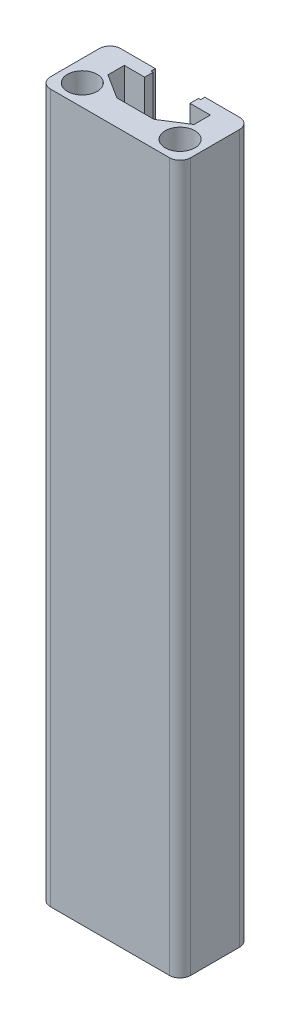
ISO-10303-21;
HEADER;
FILE_DESCRIPTION(('STEP AP214'),'2;1');
FILE_NAME('part.step','',(''),(''),'','','');
FILE_SCHEMA(('AUTOMOTIVE_DESIGN { 1 0 10303 214 1 1 1 1 }'));
ENDSEC;
DATA;
#1=APPLICATION_CONTEXT('core data for automotive mechanical design processes');
#2=APPLICATION_PROTOCOL_DEFINITION('international standard','automotive_design',2000,#1);
#3=PRODUCT_CONTEXT('',#1,'mechanical');
#4=PRODUCT('Part','Part','',(#3));
#5=PRODUCT_RELATED_PRODUCT_CATEGORY('part','',(#4));
#6=PRODUCT_DEFINITION_FORMATION('','',#4);
#7=PRODUCT_DEFINITION_CONTEXT('part definition',#1,'design');
#8=PRODUCT_DEFINITION('design','',#6,#7);
#9=PRODUCT_DEFINITION_SHAPE('','',#8);
#10=(LENGTH_UNIT() NAMED_UNIT(*) SI_UNIT(.MILLI.,.METRE.));
#11=(NAMED_UNIT(*) PLANE_ANGLE_UNIT() SI_UNIT($,.RADIAN.));
#12=(NAMED_UNIT(*) SI_UNIT($,.STERADIAN.) SOLID_ANGLE_UNIT());
#13=UNCERTAINTY_MEASURE_WITH_UNIT(LENGTH_MEASURE(1.E-05),#10,'distance_accuracy_value','');
#14=(GEOMETRIC_REPRESENTATION_CONTEXT(3) GLOBAL_UNCERTAINTY_ASSIGNED_CONTEXT((#13)) GLOBAL_UNIT_ASSIGNED_CONTEXT((#10,
#11,#12)) REPRESENTATION_CONTEXT('',''));
#15=CARTESIAN_POINT('',(0.,0.,0.));
#16=DIRECTION('',(0.,0.,1.));
#17=DIRECTION('',(1.,0.,0.));
#18=AXIS2_PLACEMENT_3D('',#15,#16,#17);
#19=CARTESIAN_POINT('',(8.4,100.,-8.4));
#20=DIRECTION('',(0.,-1.,0.));
#21=DIRECTION('',(0.,0.,-1.));
#22=AXIS2_PLACEMENT_3D('',#19,#20,#21);
#23=PLANE('',#22);
#24=DIRECTION('',(-0.844508578449678,0.,-0.535542025358332));
#25=VECTOR('',#24,1.);
#26=CARTESIAN_POINT('',(-6.07478831126901,100.,-5.79297124600639));
#27=LINE('',#26,#25);
#28=CARTESIAN_POINT('',(-2.61664134641278,100.,-3.6));
#29=VERTEX_POINT('',#28);
#30=CARTESIAN_POINT('',(-6.07478831126901,100.,-5.79297124600639));
#31=VERTEX_POINT('',#30);
#32=EDGE_CURVE('E294',#29,#31,#27,.T.);
#33=ORIENTED_EDGE('',*,*,#32,.T.);
#34=DIRECTION('',(0.,0.,-1.));
#35=VECTOR('',#34,1.);
#36=CARTESIAN_POINT('',(-6.07478831126901,100.,-8.10000000000001));
#37=LINE('',#36,#35);
#38=CARTESIAN_POINT('',(-6.07478831126901,100.,-8.10000000000001));
#39=VERTEX_POINT('',#38);
#40=EDGE_CURVE('E146',#31,#39,#37,.T.);
#41=ORIENTED_EDGE('',*,*,#40,.T.);
#42=DIRECTION('',(1.,0.,0.));
#43=VECTOR('',#42,1.);
#44=CARTESIAN_POINT('',(-3.2,100.,-8.10000000000001));
#45=LINE('',#44,#43);
#46=CARTESIAN_POINT('',(-3.2,100.,-8.10000000000001));
#47=VERTEX_POINT('',#46);
#48=EDGE_CURVE('E371',#39,#47,#45,.T.);
#49=ORIENTED_EDGE('',*,*,#48,.T.);
#50=DIRECTION('',(0.,0.,-1.));
#51=VECTOR('',#50,1.);
#52=CARTESIAN_POINT('',(-3.2,100.,-9.28849840255591));
#53=LINE('',#52,#51);
#54=CARTESIAN_POINT('',(-3.2,100.,-9.28849840255591));
#55=VERTEX_POINT('',#54);
#56=EDGE_CURVE('E391',#47,#55,#53,.T.);
#57=ORIENTED_EDGE('',*,*,#56,.T.);
#58=DIRECTION('',(-1.,0.,0.));
#59=VECTOR('',#58,1.);
#60=CARTESIAN_POINT('',(-3.5,100.,-9.28849840255591));
#61=LINE('',#60,#59);
#62=CARTESIAN_POINT('',(-3.5,100.,-9.28849840255591));
#63=VERTEX_POINT('',#62);
#64=EDGE_CURVE('E387',#55,#63,#61,.T.);
#65=ORIENTED_EDGE('',*,*,#64,.T.);
#66=DIRECTION('',(0.,0.,-1.));
#67=VECTOR('',#66,1.);
#68=CARTESIAN_POINT('',(-3.5,100.,-9.9));
#69=LINE('',#68,#67);
#70=CARTESIAN_POINT('',(-3.5,100.,-9.9));
#71=VERTEX_POINT('',#70);
#72=EDGE_CURVE('E390',#63,#71,#69,.T.);
#73=ORIENTED_EDGE('',*,*,#72,.T.);
#74=DIRECTION('',(-1.,0.,0.));
#75=VECTOR('',#74,1.);
#76=CARTESIAN_POINT('',(-8.39999999999999,100.,-9.9));
#77=LINE('',#76,#75);
#78=CARTESIAN_POINT('',(-8.39999999999999,100.,-9.9));
#79=VERTEX_POINT('',#78);
#80=EDGE_CURVE('E395',#71,#79,#77,.T.);
#81=ORIENTED_EDGE('',*,*,#80,.T.);
#82=CARTESIAN_POINT('',(-8.4,100.,-8.4));
#83=DIRECTION('',(0.,1.,0.));
#84=DIRECTION('',(0.,0.,-1.));
#85=AXIS2_PLACEMENT_3D('',#82,#83,#84);
#86=CIRCLE('',#85,1.5);
#87=CARTESIAN_POINT('',(-9.9,100.,-8.39999999999999));
#88=VERTEX_POINT('',#87);
#89=EDGE_CURVE('E402',#79,#88,#86,.T.);
#90=ORIENTED_EDGE('',*,*,#89,.T.);
#91=DIRECTION('',(0.,0.,1.));
#92=VECTOR('',#91,1.);
#93=CARTESIAN_POINT('',(-9.9,100.,-1.50000000000001));
#94=LINE('',#93,#92);
#95=CARTESIAN_POINT('',(-9.9,100.,-1.50000000000001));
#96=VERTEX_POINT('',#95);
#97=EDGE_CURVE('E405',#88,#96,#94,.T.);
#98=ORIENTED_EDGE('',*,*,#97,.T.);
#99=CARTESIAN_POINT('',(-8.4,100.,-1.5));
#100=DIRECTION('',(0.,1.,0.));
#101=DIRECTION('',(0.,0.,-1.));
#102=AXIS2_PLACEMENT_3D('',#99,#100,#101);
#103=CIRCLE('',#102,1.5);
#104=CARTESIAN_POINT('',(-8.39999999999999,100.,0.));
#105=VERTEX_POINT('',#104);
#106=EDGE_CURVE('E408',#96,#105,#103,.T.);
#107=ORIENTED_EDGE('',*,*,#106,.T.);
#108=DIRECTION('',(1.,0.,0.));
#109=VECTOR('',#108,1.);
#110=CARTESIAN_POINT('',(8.39999999999999,100.,0.));
#111=LINE('',#110,#109);
#112=CARTESIAN_POINT('',(8.39999999999999,100.,0.));
#113=VERTEX_POINT('',#112);
#114=EDGE_CURVE('E411',#105,#113,#111,.T.);
#115=ORIENTED_EDGE('',*,*,#114,.T.);
#116=CARTESIAN_POINT('',(8.4,100.,-1.5));
#117=DIRECTION('',(0.,1.,0.));
#118=DIRECTION('',(0.,0.,-1.));
#119=AXIS2_PLACEMENT_3D('',#116,#117,#118);
#120=CIRCLE('',#119,1.5);
#121=CARTESIAN_POINT('',(9.9,100.,-1.50000000000001));
#122=VERTEX_POINT('',#121);
#123=EDGE_CURVE('E414',#113,#122,#120,.T.);
#124=ORIENTED_EDGE('',*,*,#123,.T.);
#125=DIRECTION('',(0.,0.,-1.));
#126=VECTOR('',#125,1.);
#127=CARTESIAN_POINT('',(9.9,100.,-1.50000000000001));
#128=LINE('',#127,#126);
#129=CARTESIAN_POINT('',(9.9,100.,-8.39999999999999));
#130=VERTEX_POINT('',#129);
#131=EDGE_CURVE('E417',#122,#130,#128,.T.);
#132=ORIENTED_EDGE('',*,*,#131,.T.);
#133=CARTESIAN_POINT('',(8.4,100.,-8.4));
#134=DIRECTION('',(0.,1.,0.));
#135=DIRECTION('',(0.,0.,-1.));
#136=AXIS2_PLACEMENT_3D('',#133,#134,#135);
#137=CIRCLE('',#136,1.5);
#138=CARTESIAN_POINT('',(8.39999999999999,100.,-9.9));
#139=VERTEX_POINT('',#138);
#140=EDGE_CURVE('E420',#130,#139,#137,.T.);
#141=ORIENTED_EDGE('',*,*,#140,.T.);
#142=DIRECTION('',(-1.,0.,0.));
#143=VECTOR('',#142,1.);
#144=CARTESIAN_POINT('',(8.39999999999999,100.,-9.9));
#145=LINE('',#144,#143);
#146=CARTESIAN_POINT('',(3.5,100.,-9.9));
#147=VERTEX_POINT('',#146);
#148=EDGE_CURVE('E423',#139,#147,#145,.T.);
#149=ORIENTED_EDGE('',*,*,#148,.T.);
#150=DIRECTION('',(0.,0.,1.));
#151=VECTOR('',#150,1.);
#152=CARTESIAN_POINT('',(3.5,100.,-9.9));
#153=LINE('',#152,#151);
#154=CARTESIAN_POINT('',(3.5,100.,-9.28849840255591));
#155=VERTEX_POINT('',#154);
#156=EDGE_CURVE('E426',#147,#155,#153,.T.);
#157=ORIENTED_EDGE('',*,*,#156,.T.);
#158=DIRECTION('',(-1.,0.,0.));
#159=VECTOR('',#158,1.);
#160=CARTESIAN_POINT('',(3.5,100.,-9.28849840255591));
#161=LINE('',#160,#159);
#162=CARTESIAN_POINT('',(3.2,100.,-9.28849840255591));
#163=VERTEX_POINT('',#162);
#164=EDGE_CURVE('E429',#155,#163,#161,.T.);
#165=ORIENTED_EDGE('',*,*,#164,.T.);
#166=DIRECTION('',(0.,0.,1.));
#167=VECTOR('',#166,1.);
#168=CARTESIAN_POINT('',(3.2,100.,-9.28849840255591));
#169=LINE('',#168,#167);
#170=CARTESIAN_POINT('',(3.2,100.,-8.10000000000001));
#171=VERTEX_POINT('',#170);
#172=EDGE_CURVE('E432',#163,#171,#169,.T.);
#173=ORIENTED_EDGE('',*,*,#172,.T.);
#174=DIRECTION('',(1.,0.,0.));
#175=VECTOR('',#174,1.);
#176=CARTESIAN_POINT('',(3.2,100.,-8.10000000000001));
#177=LINE('',#176,#175);
#178=CARTESIAN_POINT('',(6.07478831126901,100.,-8.10000000000001));
#179=VERTEX_POINT('',#178);
#180=EDGE_CURVE('E207',#171,#179,#177,.T.);
#181=ORIENTED_EDGE('',*,*,#180,.T.);
#182=DIRECTION('',(0.,0.,1.));
#183=VECTOR('',#182,1.);
#184=CARTESIAN_POINT('',(6.07478831126901,100.,-8.10000000000001));
#185=LINE('',#184,#183);
#186=CARTESIAN_POINT('',(6.07478831126901,100.,-5.79297124600639));
#187=VERTEX_POINT('',#186);
#188=EDGE_CURVE('E201',#179,#187,#185,.T.);
#189=ORIENTED_EDGE('',*,*,#188,.T.);
#190=DIRECTION('',(-0.844508578449678,0.,0.535542025358332));
#191=VECTOR('',#190,1.);
#192=CARTESIAN_POINT('',(6.07478831126901,100.,-5.79297124600639));
#193=LINE('',#192,#191);
#194=CARTESIAN_POINT('',(2.61664134641278,100.,-3.6));
#195=VERTEX_POINT('',#194);
#196=EDGE_CURVE('E205',#187,#195,#193,.T.);
#197=ORIENTED_EDGE('',*,*,#196,.T.);
#198=DIRECTION('',(-1.,0.,0.));
#199=VECTOR('',#198,1.);
#200=CARTESIAN_POINT('',(-2.61664134641278,100.,-3.6));
#201=LINE('',#200,#199);
#202=EDGE_CURVE('E61',#195,#29,#201,.T.);
#203=ORIENTED_EDGE('',*,*,#202,.T.);
#204=EDGE_LOOP('',(#33,#41,#49,#57,#65,#73,#81,#90,#98,#107,#115,#124,#132,#141,#149,#157,#165,
#173,#181,#189,#197,#203));
#205=FACE_BOUND('',#204,.T.);
#206=CARTESIAN_POINT('',(-6.9,100.,-3.));
#207=DIRECTION('',(0.,1.,0.));
#208=DIRECTION('',(0.,0.,1.));
#209=AXIS2_PLACEMENT_3D('',#206,#207,#208);
#210=CIRCLE('',#209,2.1);
#211=CARTESIAN_POINT('',(-6.9,100.,-0.899999999999997));
#212=VERTEX_POINT('',#211);
#213=EDGE_CURVE('E234',#212,#212,#210,.T.);
#214=ORIENTED_EDGE('',*,*,#213,.F.);
#215=EDGE_LOOP('',(#214));
#216=FACE_BOUND('',#215,.T.);
#217=CARTESIAN_POINT('',(6.9,100.,-3.));
#218=DIRECTION('',(0.,1.,0.));
#219=DIRECTION('',(0.,0.,-1.));
#220=AXIS2_PLACEMENT_3D('',#217,#218,#219);
#221=CIRCLE('',#220,2.1);
#222=CARTESIAN_POINT('',(6.9,100.,-5.1));
#223=VERTEX_POINT('',#222);
#224=EDGE_CURVE('E475',#223,#223,#221,.T.);
#225=ORIENTED_EDGE('',*,*,#224,.F.);
#226=EDGE_LOOP('',(#225));
#227=FACE_BOUND('',#226,.T.);
#228=ADVANCED_FACE('F43',(#205,#216,#227),#23,.F.);
#229=CARTESIAN_POINT('',(8.4,0.,-8.4));
#230=DIRECTION('',(0.,-1.,0.));
#231=DIRECTION('',(0.,0.,-1.));
#232=AXIS2_PLACEMENT_3D('',#229,#230,#231);
#233=PLANE('',#232);
#234=CARTESIAN_POINT('',(-6.9,0.,-3.));
#235=DIRECTION('',(0.,1.,0.));
#236=DIRECTION('',(0.,0.,1.));
#237=AXIS2_PLACEMENT_3D('',#234,#235,#236);
#238=CIRCLE('',#237,2.1);
#239=CARTESIAN_POINT('',(-6.9,0.,-0.899999999999997));
#240=VERTEX_POINT('',#239);
#241=EDGE_CURVE('E482',#240,#240,#238,.T.);
#242=ORIENTED_EDGE('',*,*,#241,.T.);
#243=EDGE_LOOP('',(#242));
#244=FACE_BOUND('',#243,.T.);
#245=DIRECTION('',(-0.844508578449678,0.,-0.535542025358332));
#246=VECTOR('',#245,1.);
#247=CARTESIAN_POINT('',(-6.07478831126901,0.,-5.79297124600639));
#248=LINE('',#247,#246);
#249=CARTESIAN_POINT('',(-2.61664134641278,0.,-3.6));
#250=VERTEX_POINT('',#249);
#251=CARTESIAN_POINT('',(-6.07478831126901,0.,-5.79297124600639));
#252=VERTEX_POINT('',#251);
#253=EDGE_CURVE('E229',#250,#252,#248,.T.);
#254=ORIENTED_EDGE('',*,*,#253,.F.);
#255=DIRECTION('',(-1.,0.,0.));
#256=VECTOR('',#255,1.);
#257=CARTESIAN_POINT('',(-2.61664134641278,0.,-3.6));
#258=LINE('',#257,#256);
#259=CARTESIAN_POINT('',(2.61664134641278,0.,-3.6));
#260=VERTEX_POINT('',#259);
#261=EDGE_CURVE('E138',#260,#250,#258,.T.);
#262=ORIENTED_EDGE('',*,*,#261,.F.);
#263=DIRECTION('',(-0.844508578449678,0.,0.535542025358332));
#264=VECTOR('',#263,1.);
#265=CARTESIAN_POINT('',(6.07478831126901,0.,-5.79297124600639));
#266=LINE('',#265,#264);
#267=CARTESIAN_POINT('',(6.07478831126901,0.,-5.79297124600639));
#268=VERTEX_POINT('',#267);
#269=EDGE_CURVE('E132',#268,#260,#266,.T.);
#270=ORIENTED_EDGE('',*,*,#269,.F.);
#271=DIRECTION('',(0.,0.,1.));
#272=VECTOR('',#271,1.);
#273=CARTESIAN_POINT('',(6.07478831126901,0.,-8.10000000000001));
#274=LINE('',#273,#272);
#275=CARTESIAN_POINT('',(6.07478831126901,0.,-8.10000000000001));
#276=VERTEX_POINT('',#275);
#277=EDGE_CURVE('E216',#276,#268,#274,.T.);
#278=ORIENTED_EDGE('',*,*,#277,.F.);
#279=DIRECTION('',(1.,0.,0.));
#280=VECTOR('',#279,1.);
#281=CARTESIAN_POINT('',(3.2,0.,-8.10000000000001));
#282=LINE('',#281,#280);
#283=CARTESIAN_POINT('',(3.2,0.,-8.10000000000001));
#284=VERTEX_POINT('',#283);
#285=EDGE_CURVE('E285',#284,#276,#282,.T.);
#286=ORIENTED_EDGE('',*,*,#285,.F.);
#287=DIRECTION('',(0.,0.,1.));
#288=VECTOR('',#287,1.);
#289=CARTESIAN_POINT('',(3.2,0.,-9.28849840255591));
#290=LINE('',#289,#288);
#291=CARTESIAN_POINT('',(3.2,0.,-9.28849840255591));
#292=VERTEX_POINT('',#291);
#293=EDGE_CURVE('E282',#292,#284,#290,.T.);
#294=ORIENTED_EDGE('',*,*,#293,.F.);
#295=DIRECTION('',(-1.,0.,0.));
#296=VECTOR('',#295,1.);
#297=CARTESIAN_POINT('',(3.5,0.,-9.28849840255591));
#298=LINE('',#297,#296);
#299=CARTESIAN_POINT('',(3.5,0.,-9.28849840255591));
#300=VERTEX_POINT('',#299);
#301=EDGE_CURVE('E279',#300,#292,#298,.T.);
#302=ORIENTED_EDGE('',*,*,#301,.F.);
#303=DIRECTION('',(0.,0.,1.));
#304=VECTOR('',#303,1.);
#305=CARTESIAN_POINT('',(3.5,0.,-9.9));
#306=LINE('',#305,#304);
#307=CARTESIAN_POINT('',(3.5,0.,-9.9));
#308=VERTEX_POINT('',#307);
#309=EDGE_CURVE('E276',#308,#300,#306,.T.);
#310=ORIENTED_EDGE('',*,*,#309,.F.);
#311=DIRECTION('',(-1.,0.,0.));
#312=VECTOR('',#311,1.);
#313=CARTESIAN_POINT('',(8.39999999999999,0.,-9.9));
#314=LINE('',#313,#312);
#315=CARTESIAN_POINT('',(8.39999999999999,0.,-9.9));
#316=VERTEX_POINT('',#315);
#317=EDGE_CURVE('E273',#316,#308,#314,.T.);
#318=ORIENTED_EDGE('',*,*,#317,.F.);
#319=CARTESIAN_POINT('',(8.4,0.,-8.4));
#320=DIRECTION('',(0.,1.,0.));
#321=DIRECTION('',(0.,0.,-1.));
#322=AXIS2_PLACEMENT_3D('',#319,#320,#321);
#323=CIRCLE('',#322,1.5);
#324=CARTESIAN_POINT('',(9.9,0.,-8.39999999999999));
#325=VERTEX_POINT('',#324);
#326=EDGE_CURVE('E270',#325,#316,#323,.T.);
#327=ORIENTED_EDGE('',*,*,#326,.F.);
#328=DIRECTION('',(0.,0.,-1.));
#329=VECTOR('',#328,1.);
#330=CARTESIAN_POINT('',(9.9,0.,-1.50000000000001));
#331=LINE('',#330,#329);
#332=CARTESIAN_POINT('',(9.9,0.,-1.50000000000001));
#333=VERTEX_POINT('',#332);
#334=EDGE_CURVE('E267',#333,#325,#331,.T.);
#335=ORIENTED_EDGE('',*,*,#334,.F.);
#336=CARTESIAN_POINT('',(8.4,0.,-1.5));
#337=DIRECTION('',(0.,1.,0.));
#338=DIRECTION('',(0.,0.,-1.));
#339=AXIS2_PLACEMENT_3D('',#336,#337,#338);
#340=CIRCLE('',#339,1.5);
#341=CARTESIAN_POINT('',(8.39999999999999,0.,0.));
#342=VERTEX_POINT('',#341);
#343=EDGE_CURVE('E264',#342,#333,#340,.T.);
#344=ORIENTED_EDGE('',*,*,#343,.F.);
#345=DIRECTION('',(1.,0.,0.));
#346=VECTOR('',#345,1.);
#347=CARTESIAN_POINT('',(8.39999999999999,0.,0.));
#348=LINE('',#347,#346);
#349=CARTESIAN_POINT('',(-8.39999999999999,0.,0.));
#350=VERTEX_POINT('',#349);
#351=EDGE_CURVE('E261',#350,#342,#348,.T.);
#352=ORIENTED_EDGE('',*,*,#351,.F.);
#353=CARTESIAN_POINT('',(-8.4,0.,-1.5));
#354=DIRECTION('',(0.,1.,0.));
#355=DIRECTION('',(0.,0.,-1.));
#356=AXIS2_PLACEMENT_3D('',#353,#354,#355);
#357=CIRCLE('',#356,1.5);
#358=CARTESIAN_POINT('',(-9.9,0.,-1.50000000000001));
#359=VERTEX_POINT('',#358);
#360=EDGE_CURVE('E258',#359,#350,#357,.T.);
#361=ORIENTED_EDGE('',*,*,#360,.F.);
#362=DIRECTION('',(0.,0.,1.));
#363=VECTOR('',#362,1.);
#364=CARTESIAN_POINT('',(-9.9,0.,-1.50000000000001));
#365=LINE('',#364,#363);
#366=CARTESIAN_POINT('',(-9.9,0.,-8.39999999999999));
#367=VERTEX_POINT('',#366);
#368=EDGE_CURVE('E255',#367,#359,#365,.T.);
#369=ORIENTED_EDGE('',*,*,#368,.F.);
#370=CARTESIAN_POINT('',(-8.4,0.,-8.4));
#371=DIRECTION('',(0.,1.,0.));
#372=DIRECTION('',(0.,0.,-1.));
#373=AXIS2_PLACEMENT_3D('',#370,#371,#372);
#374=CIRCLE('',#373,1.5);
#375=CARTESIAN_POINT('',(-8.39999999999999,0.,-9.9));
#376=VERTEX_POINT('',#375);
#377=EDGE_CURVE('E252',#376,#367,#374,.T.);
#378=ORIENTED_EDGE('',*,*,#377,.F.);
#379=DIRECTION('',(-1.,0.,0.));
#380=VECTOR('',#379,1.);
#381=CARTESIAN_POINT('',(-8.39999999999999,0.,-9.9));
#382=LINE('',#381,#380);
#383=CARTESIAN_POINT('',(-3.5,0.,-9.9));
#384=VERTEX_POINT('',#383);
#385=EDGE_CURVE('E249',#384,#376,#382,.T.);
#386=ORIENTED_EDGE('',*,*,#385,.F.);
#387=DIRECTION('',(0.,0.,-1.));
#388=VECTOR('',#387,1.);
#389=CARTESIAN_POINT('',(-3.5,0.,-9.9));
#390=LINE('',#389,#388);
#391=CARTESIAN_POINT('',(-3.5,0.,-9.28849840255591));
#392=VERTEX_POINT('',#391);
#393=EDGE_CURVE('E246',#392,#384,#390,.T.);
#394=ORIENTED_EDGE('',*,*,#393,.F.);
#395=DIRECTION('',(-1.,0.,0.));
#396=VECTOR('',#395,1.);
#397=CARTESIAN_POINT('',(-3.5,0.,-9.28849840255591));
#398=LINE('',#397,#396);
#399=CARTESIAN_POINT('',(-3.2,0.,-9.28849840255591));
#400=VERTEX_POINT('',#399);
#401=EDGE_CURVE('E243',#400,#392,#398,.T.);
#402=ORIENTED_EDGE('',*,*,#401,.F.);
#403=DIRECTION('',(0.,0.,-1.));
#404=VECTOR('',#403,1.);
#405=CARTESIAN_POINT('',(-3.2,0.,-9.28849840255591));
#406=LINE('',#405,#404);
#407=CARTESIAN_POINT('',(-3.2,0.,-8.10000000000001));
#408=VERTEX_POINT('',#407);
#409=EDGE_CURVE('E240',#408,#400,#406,.T.);
#410=ORIENTED_EDGE('',*,*,#409,.F.);
#411=DIRECTION('',(1.,0.,0.));
#412=VECTOR('',#411,1.);
#413=CARTESIAN_POINT('',(-3.2,0.,-8.10000000000001));
#414=LINE('',#413,#412);
#415=CARTESIAN_POINT('',(-6.07478831126901,0.,-8.10000000000001));
#416=VERTEX_POINT('',#415);
#417=EDGE_CURVE('E237',#416,#408,#414,.T.);
#418=ORIENTED_EDGE('',*,*,#417,.F.);
#419=DIRECTION('',(0.,0.,-1.));
#420=VECTOR('',#419,1.);
#421=CARTESIAN_POINT('',(-6.07478831126901,0.,-8.10000000000001));
#422=LINE('',#421,#420);
#423=EDGE_CURVE('E233',#252,#416,#422,.T.);
#424=ORIENTED_EDGE('',*,*,#423,.F.);
#425=EDGE_LOOP('',(#254,#262,#270,#278,#286,#294,#302,#310,#318,#327,#335,#344,#352,#361,#369,
#378,#386,#394,#402,#410,#418,#424));
#426=FACE_BOUND('',#425,.T.);
#427=CARTESIAN_POINT('',(6.9,0.,-3.));
#428=DIRECTION('',(0.,1.,0.));
#429=DIRECTION('',(0.,0.,-1.));
#430=AXIS2_PLACEMENT_3D('',#427,#428,#429);
#431=CIRCLE('',#430,2.1);
#432=CARTESIAN_POINT('',(6.9,0.,-5.1));
#433=VERTEX_POINT('',#432);
#434=EDGE_CURVE('E478',#433,#433,#431,.T.);
#435=ORIENTED_EDGE('',*,*,#434,.T.);
#436=EDGE_LOOP('',(#435));
#437=FACE_BOUND('',#436,.T.);
#438=ADVANCED_FACE('F375',(#244,#426,#437),#233,.T.);
#439=CARTESIAN_POINT('',(-6.07478831126901,100.,-5.79297124600639));
#440=DIRECTION('',(-0.535542025358332,0.,0.844508578449678));
#441=DIRECTION('',(0.844508578449678,0.,0.535542025358332));
#442=AXIS2_PLACEMENT_3D('',#439,#440,#441);
#443=PLANE('',#442);
#444=ORIENTED_EDGE('',*,*,#253,.T.);
#445=DIRECTION('',(0.,-1.,0.));
#446=VECTOR('',#445,1.);
#447=CARTESIAN_POINT('',(-6.07478831126901,100.,-5.79297124600639));
#448=LINE('',#447,#446);
#449=EDGE_CURVE('E11',#31,#252,#448,.T.);
#450=ORIENTED_EDGE('',*,*,#449,.F.);
#451=ORIENTED_EDGE('',*,*,#32,.F.);
#452=DIRECTION('',(0.,-1.,0.));
#453=VECTOR('',#452,1.);
#454=CARTESIAN_POINT('',(-2.61664134641278,100.,-3.6));
#455=LINE('',#454,#453);
#456=EDGE_CURVE('E225',#29,#250,#455,.T.);
#457=ORIENTED_EDGE('',*,*,#456,.T.);
#458=EDGE_LOOP('',(#444,#450,#451,#457));
#459=FACE_BOUND('',#458,.T.);
#460=ADVANCED_FACE('F45',(#459),#443,.F.);
#461=CARTESIAN_POINT('',(-6.07478831126901,100.,-8.10000000000001));
#462=DIRECTION('',(-1.,0.,0.));
#463=DIRECTION('',(0.,0.,1.));
#464=AXIS2_PLACEMENT_3D('',#461,#462,#463);
#465=PLANE('',#464);
#466=ORIENTED_EDGE('',*,*,#423,.T.);
#467=DIRECTION('',(0.,-1.,0.));
#468=VECTOR('',#467,1.);
#469=CARTESIAN_POINT('',(-6.07478831126901,100.,-8.10000000000001));
#470=LINE('',#469,#468);
#471=EDGE_CURVE('E53',#39,#416,#470,.T.);
#472=ORIENTED_EDGE('',*,*,#471,.F.);
#473=ORIENTED_EDGE('',*,*,#40,.F.);
#474=ORIENTED_EDGE('',*,*,#449,.T.);
#475=EDGE_LOOP('',(#466,#472,#473,#474));
#476=FACE_BOUND('',#475,.T.);
#477=ADVANCED_FACE('F702',(#476),#465,.F.);
#478=CARTESIAN_POINT('',(-3.2,100.,-8.10000000000001));
#479=DIRECTION('',(0.,0.,-1.));
#480=DIRECTION('',(-1.,0.,0.));
#481=AXIS2_PLACEMENT_3D('',#478,#479,#480);
#482=PLANE('',#481);
#483=ORIENTED_EDGE('',*,*,#417,.T.);
#484=DIRECTION('',(0.,-1.,0.));
#485=VECTOR('',#484,1.);
#486=CARTESIAN_POINT('',(-3.2,100.,-8.10000000000001));
#487=LINE('',#486,#485);
#488=EDGE_CURVE('E361',#47,#408,#487,.T.);
#489=ORIENTED_EDGE('',*,*,#488,.F.);
#490=ORIENTED_EDGE('',*,*,#48,.F.);
#491=ORIENTED_EDGE('',*,*,#471,.T.);
#492=EDGE_LOOP('',(#483,#489,#490,#491));
#493=FACE_BOUND('',#492,.T.);
#494=ADVANCED_FACE('F369',(#493),#482,.F.);
#495=CARTESIAN_POINT('',(-3.2,100.,-9.28849840255591));
#496=DIRECTION('',(-1.,0.,0.));
#497=DIRECTION('',(0.,0.,1.));
#498=AXIS2_PLACEMENT_3D('',#495,#496,#497);
#499=PLANE('',#498);
#500=ORIENTED_EDGE('',*,*,#409,.T.);
#501=DIRECTION('',(0.,-1.,0.));
#502=VECTOR('',#501,1.);
#503=CARTESIAN_POINT('',(-3.2,100.,-9.28849840255591));
#504=LINE('',#503,#502);
#505=EDGE_CURVE('E357',#55,#400,#504,.T.);
#506=ORIENTED_EDGE('',*,*,#505,.F.);
#507=ORIENTED_EDGE('',*,*,#56,.F.);
#508=ORIENTED_EDGE('',*,*,#488,.T.);
#509=EDGE_LOOP('',(#500,#506,#507,#508));
#510=FACE_BOUND('',#509,.T.);
#511=ADVANCED_FACE('F381',(#510),#499,.F.);
#512=CARTESIAN_POINT('',(-3.5,100.,-9.28849840255591));
#513=DIRECTION('',(0.,0.,1.));
#514=DIRECTION('',(1.,0.,0.));
#515=AXIS2_PLACEMENT_3D('',#512,#513,#514);
#516=PLANE('',#515);
#517=ORIENTED_EDGE('',*,*,#401,.T.);
#518=DIRECTION('',(0.,-1.,0.));
#519=VECTOR('',#518,1.);
#520=CARTESIAN_POINT('',(-3.5,100.,-9.28849840255591));
#521=LINE('',#520,#519);
#522=EDGE_CURVE('E353',#63,#392,#521,.T.);
#523=ORIENTED_EDGE('',*,*,#522,.F.);
#524=ORIENTED_EDGE('',*,*,#64,.F.);
#525=ORIENTED_EDGE('',*,*,#505,.T.);
#526=EDGE_LOOP('',(#517,#523,#524,#525));
#527=FACE_BOUND('',#526,.T.);
#528=ADVANCED_FACE('F385',(#527),#516,.F.);
#529=CARTESIAN_POINT('',(-3.5,100.,-9.9));
#530=DIRECTION('',(-1.,0.,0.));
#531=DIRECTION('',(0.,0.,1.));
#532=AXIS2_PLACEMENT_3D('',#529,#530,#531);
#533=PLANE('',#532);
#534=ORIENTED_EDGE('',*,*,#393,.T.);
#535=DIRECTION('',(0.,-1.,0.));
#536=VECTOR('',#535,1.);
#537=CARTESIAN_POINT('',(-3.5,100.,-9.9));
#538=LINE('',#537,#536);
#539=EDGE_CURVE('E349',#71,#384,#538,.T.);
#540=ORIENTED_EDGE('',*,*,#539,.F.);
#541=ORIENTED_EDGE('',*,*,#72,.F.);
#542=ORIENTED_EDGE('',*,*,#522,.T.);
#543=EDGE_LOOP('',(#534,#540,#541,#542));
#544=FACE_BOUND('',#543,.T.);
#545=ADVANCED_FACE('F663',(#544),#533,.F.);
#546=CARTESIAN_POINT('',(-8.39999999999999,100.,-9.9));
#547=DIRECTION('',(0.,0.,1.));
#548=DIRECTION('',(1.,0.,0.));
#549=AXIS2_PLACEMENT_3D('',#546,#547,#548);
#550=PLANE('',#549);
#551=ORIENTED_EDGE('',*,*,#385,.T.);
#552=DIRECTION('',(0.,-1.,0.));
#553=VECTOR('',#552,1.);
#554=CARTESIAN_POINT('',(-8.39999999999999,100.,-9.9));
#555=LINE('',#554,#553);
#556=EDGE_CURVE('E345',#79,#376,#555,.T.);
#557=ORIENTED_EDGE('',*,*,#556,.F.);
#558=ORIENTED_EDGE('',*,*,#80,.F.);
#559=ORIENTED_EDGE('',*,*,#539,.T.);
#560=EDGE_LOOP('',(#551,#557,#558,#559));
#561=FACE_BOUND('',#560,.T.);
#562=ADVANCED_FACE('F652',(#561),#550,.F.);
#563=CARTESIAN_POINT('',(-8.4,100.,-8.4));
#564=DIRECTION('',(0.,-1.,0.));
#565=DIRECTION('',(0.,0.,-1.));
#566=AXIS2_PLACEMENT_3D('',#563,#564,#565);
#567=CYLINDRICAL_SURFACE('',#566,1.5);
#568=ORIENTED_EDGE('',*,*,#377,.T.);
#569=DIRECTION('',(0.,-1.,0.));
#570=VECTOR('',#569,1.);
#571=CARTESIAN_POINT('',(-9.9,100.,-8.39999999999999));
#572=LINE('',#571,#570);
#573=EDGE_CURVE('E341',#88,#367,#572,.T.);
#574=ORIENTED_EDGE('',*,*,#573,.F.);
#575=ORIENTED_EDGE('',*,*,#89,.F.);
#576=ORIENTED_EDGE('',*,*,#556,.T.);
#577=EDGE_LOOP('',(#568,#574,#575,#576));
#578=FACE_BOUND('',#577,.T.);
#579=ADVANCED_FACE('F641',(#578),#567,.T.);
#580=CARTESIAN_POINT('',(-9.9,100.,-1.50000000000001));
#581=DIRECTION('',(1.,0.,0.));
#582=DIRECTION('',(0.,0.,-1.));
#583=AXIS2_PLACEMENT_3D('',#580,#581,#582);
#584=PLANE('',#583);
#585=ORIENTED_EDGE('',*,*,#368,.T.);
#586=DIRECTION('',(0.,-1.,0.));
#587=VECTOR('',#586,1.);
#588=CARTESIAN_POINT('',(-9.9,100.,-1.50000000000001));
#589=LINE('',#588,#587);
#590=EDGE_CURVE('E337',#96,#359,#589,.T.);
#591=ORIENTED_EDGE('',*,*,#590,.F.);
#592=ORIENTED_EDGE('',*,*,#97,.F.);
#593=ORIENTED_EDGE('',*,*,#573,.T.);
#594=EDGE_LOOP('',(#585,#591,#592,#593));
#595=FACE_BOUND('',#594,.T.);
#596=ADVANCED_FACE('F630',(#595),#584,.F.);
#597=CARTESIAN_POINT('',(-8.4,100.,-1.5));
#598=DIRECTION('',(0.,-1.,0.));
#599=DIRECTION('',(0.,0.,-1.));
#600=AXIS2_PLACEMENT_3D('',#597,#598,#599);
#601=CYLINDRICAL_SURFACE('',#600,1.5);
#602=ORIENTED_EDGE('',*,*,#360,.T.);
#603=DIRECTION('',(0.,-1.,0.));
#604=VECTOR('',#603,1.);
#605=CARTESIAN_POINT('',(-8.39999999999999,100.,0.));
#606=LINE('',#605,#604);
#607=EDGE_CURVE('E333',#105,#350,#606,.T.);
#608=ORIENTED_EDGE('',*,*,#607,.F.);
#609=ORIENTED_EDGE('',*,*,#106,.F.);
#610=ORIENTED_EDGE('',*,*,#590,.T.);
#611=EDGE_LOOP('',(#602,#608,#609,#610));
#612=FACE_BOUND('',#611,.T.);
#613=ADVANCED_FACE('F619',(#612),#601,.T.);
#614=CARTESIAN_POINT('',(8.39999999999999,100.,0.));
#615=DIRECTION('',(0.,0.,-1.));
#616=DIRECTION('',(-1.,0.,0.));
#617=AXIS2_PLACEMENT_3D('',#614,#615,#616);
#618=PLANE('',#617);
#619=ORIENTED_EDGE('',*,*,#351,.T.);
#620=DIRECTION('',(0.,-1.,0.));
#621=VECTOR('',#620,1.);
#622=CARTESIAN_POINT('',(8.39999999999999,100.,0.));
#623=LINE('',#622,#621);
#624=EDGE_CURVE('E329',#113,#342,#623,.T.);
#625=ORIENTED_EDGE('',*,*,#624,.F.);
#626=ORIENTED_EDGE('',*,*,#114,.F.);
#627=ORIENTED_EDGE('',*,*,#607,.T.);
#628=EDGE_LOOP('',(#619,#625,#626,#627));
#629=FACE_BOUND('',#628,.T.);
#630=ADVANCED_FACE('F608',(#629),#618,.F.);
#631=CARTESIAN_POINT('',(8.4,100.,-1.5));
#632=DIRECTION('',(0.,-1.,0.));
#633=DIRECTION('',(0.,0.,-1.));
#634=AXIS2_PLACEMENT_3D('',#631,#632,#633);
#635=CYLINDRICAL_SURFACE('',#634,1.5);
#636=ORIENTED_EDGE('',*,*,#343,.T.);
#637=DIRECTION('',(0.,-1.,0.));
#638=VECTOR('',#637,1.);
#639=CARTESIAN_POINT('',(9.9,100.,-1.50000000000001));
#640=LINE('',#639,#638);
#641=EDGE_CURVE('E325',#122,#333,#640,.T.);
#642=ORIENTED_EDGE('',*,*,#641,.F.);
#643=ORIENTED_EDGE('',*,*,#123,.F.);
#644=ORIENTED_EDGE('',*,*,#624,.T.);
#645=EDGE_LOOP('',(#636,#642,#643,#644));
#646=FACE_BOUND('',#645,.T.);
#647=ADVANCED_FACE('F597',(#646),#635,.T.);
#648=CARTESIAN_POINT('',(9.9,100.,-1.50000000000001));
#649=DIRECTION('',(-1.,0.,0.));
#650=DIRECTION('',(0.,0.,1.));
#651=AXIS2_PLACEMENT_3D('',#648,#649,#650);
#652=PLANE('',#651);
#653=ORIENTED_EDGE('',*,*,#334,.T.);
#654=DIRECTION('',(0.,-1.,0.));
#655=VECTOR('',#654,1.);
#656=CARTESIAN_POINT('',(9.9,100.,-8.39999999999999));
#657=LINE('',#656,#655);
#658=EDGE_CURVE('E321',#130,#325,#657,.T.);
#659=ORIENTED_EDGE('',*,*,#658,.F.);
#660=ORIENTED_EDGE('',*,*,#131,.F.);
#661=ORIENTED_EDGE('',*,*,#641,.T.);
#662=EDGE_LOOP('',(#653,#659,#660,#661));
#663=FACE_BOUND('',#662,.T.);
#664=ADVANCED_FACE('F586',(#663),#652,.F.);
#665=CARTESIAN_POINT('',(8.4,100.,-8.4));
#666=DIRECTION('',(0.,-1.,0.));
#667=DIRECTION('',(0.,0.,-1.));
#668=AXIS2_PLACEMENT_3D('',#665,#666,#667);
#669=CYLINDRICAL_SURFACE('',#668,1.5);
#670=ORIENTED_EDGE('',*,*,#326,.T.);
#671=DIRECTION('',(0.,-1.,0.));
#672=VECTOR('',#671,1.);
#673=CARTESIAN_POINT('',(8.39999999999999,100.,-9.9));
#674=LINE('',#673,#672);
#675=EDGE_CURVE('E317',#139,#316,#674,.T.);
#676=ORIENTED_EDGE('',*,*,#675,.F.);
#677=ORIENTED_EDGE('',*,*,#140,.F.);
#678=ORIENTED_EDGE('',*,*,#658,.T.);
#679=EDGE_LOOP('',(#670,#676,#677,#678));
#680=FACE_BOUND('',#679,.T.);
#681=ADVANCED_FACE('F575',(#680),#669,.T.);
#682=CARTESIAN_POINT('',(8.39999999999999,100.,-9.9));
#683=DIRECTION('',(0.,0.,1.));
#684=DIRECTION('',(1.,0.,0.));
#685=AXIS2_PLACEMENT_3D('',#682,#683,#684);
#686=PLANE('',#685);
#687=ORIENTED_EDGE('',*,*,#317,.T.);
#688=DIRECTION('',(0.,-1.,0.));
#689=VECTOR('',#688,1.);
#690=CARTESIAN_POINT('',(3.5,100.,-9.9));
#691=LINE('',#690,#689);
#692=EDGE_CURVE('E313',#147,#308,#691,.T.);
#693=ORIENTED_EDGE('',*,*,#692,.F.);
#694=ORIENTED_EDGE('',*,*,#148,.F.);
#695=ORIENTED_EDGE('',*,*,#675,.T.);
#696=EDGE_LOOP('',(#687,#693,#694,#695));
#697=FACE_BOUND('',#696,.T.);
#698=ADVANCED_FACE('F564',(#697),#686,.F.);
#699=CARTESIAN_POINT('',(3.5,100.,-9.9));
#700=DIRECTION('',(1.,0.,0.));
#701=DIRECTION('',(0.,0.,-1.));
#702=AXIS2_PLACEMENT_3D('',#699,#700,#701);
#703=PLANE('',#702);
#704=ORIENTED_EDGE('',*,*,#309,.T.);
#705=DIRECTION('',(0.,-1.,0.));
#706=VECTOR('',#705,1.);
#707=CARTESIAN_POINT('',(3.5,100.,-9.28849840255591));
#708=LINE('',#707,#706);
#709=EDGE_CURVE('E309',#155,#300,#708,.T.);
#710=ORIENTED_EDGE('',*,*,#709,.F.);
#711=ORIENTED_EDGE('',*,*,#156,.F.);
#712=ORIENTED_EDGE('',*,*,#692,.T.);
#713=EDGE_LOOP('',(#704,#710,#711,#712));
#714=FACE_BOUND('',#713,.T.);
#715=ADVANCED_FACE('F553',(#714),#703,.F.);
#716=CARTESIAN_POINT('',(3.5,100.,-9.28849840255591));
#717=DIRECTION('',(0.,0.,1.));
#718=DIRECTION('',(1.,0.,0.));
#719=AXIS2_PLACEMENT_3D('',#716,#717,#718);
#720=PLANE('',#719);
#721=ORIENTED_EDGE('',*,*,#301,.T.);
#722=DIRECTION('',(0.,-1.,0.));
#723=VECTOR('',#722,1.);
#724=CARTESIAN_POINT('',(3.2,100.,-9.28849840255591));
#725=LINE('',#724,#723);
#726=EDGE_CURVE('E305',#163,#292,#725,.T.);
#727=ORIENTED_EDGE('',*,*,#726,.F.);
#728=ORIENTED_EDGE('',*,*,#164,.F.);
#729=ORIENTED_EDGE('',*,*,#709,.T.);
#730=EDGE_LOOP('',(#721,#727,#728,#729));
#731=FACE_BOUND('',#730,.T.);
#732=ADVANCED_FACE('F543',(#731),#720,.F.);
#733=CARTESIAN_POINT('',(3.2,100.,-9.28849840255591));
#734=DIRECTION('',(1.,0.,0.));
#735=DIRECTION('',(0.,0.,-1.));
#736=AXIS2_PLACEMENT_3D('',#733,#734,#735);
#737=PLANE('',#736);
#738=ORIENTED_EDGE('',*,*,#293,.T.);
#739=DIRECTION('',(0.,-1.,0.));
#740=VECTOR('',#739,1.);
#741=CARTESIAN_POINT('',(3.2,100.,-8.10000000000001));
#742=LINE('',#741,#740);
#743=EDGE_CURVE('E301',#171,#284,#742,.T.);
#744=ORIENTED_EDGE('',*,*,#743,.F.);
#745=ORIENTED_EDGE('',*,*,#172,.F.);
#746=ORIENTED_EDGE('',*,*,#726,.T.);
#747=EDGE_LOOP('',(#738,#744,#745,#746));
#748=FACE_BOUND('',#747,.T.);
#749=ADVANCED_FACE('F440',(#748),#737,.F.);
#750=CARTESIAN_POINT('',(3.2,100.,-8.10000000000001));
#751=DIRECTION('',(0.,0.,-1.));
#752=DIRECTION('',(-1.,0.,0.));
#753=AXIS2_PLACEMENT_3D('',#750,#751,#752);
#754=PLANE('',#753);
#755=ORIENTED_EDGE('',*,*,#285,.T.);
#756=DIRECTION('',(0.,-1.,0.));
#757=VECTOR('',#756,1.);
#758=CARTESIAN_POINT('',(6.07478831126901,100.,-8.10000000000001));
#759=LINE('',#758,#757);
#760=EDGE_CURVE('E218',#179,#276,#759,.T.);
#761=ORIENTED_EDGE('',*,*,#760,.F.);
#762=ORIENTED_EDGE('',*,*,#180,.F.);
#763=ORIENTED_EDGE('',*,*,#743,.T.);
#764=EDGE_LOOP('',(#755,#761,#762,#763));
#765=FACE_BOUND('',#764,.T.);
#766=ADVANCED_FACE('F444',(#765),#754,.F.);
#767=CARTESIAN_POINT('',(6.07478831126901,100.,-8.10000000000001));
#768=DIRECTION('',(1.,0.,0.));
#769=DIRECTION('',(0.,0.,-1.));
#770=AXIS2_PLACEMENT_3D('',#767,#768,#769);
#771=PLANE('',#770);
#772=ORIENTED_EDGE('',*,*,#277,.T.);
#773=DIRECTION('',(0.,-1.,0.));
#774=VECTOR('',#773,1.);
#775=CARTESIAN_POINT('',(6.07478831126901,100.,-5.79297124600639));
#776=LINE('',#775,#774);
#777=EDGE_CURVE('E213',#187,#268,#776,.T.);
#778=ORIENTED_EDGE('',*,*,#777,.F.);
#779=ORIENTED_EDGE('',*,*,#188,.F.);
#780=ORIENTED_EDGE('',*,*,#760,.T.);
#781=EDGE_LOOP('',(#772,#778,#779,#780));
#782=FACE_BOUND('',#781,.T.);
#783=ADVANCED_FACE('F214',(#782),#771,.F.);
#784=CARTESIAN_POINT('',(6.07478831126901,100.,-5.79297124600639));
#785=DIRECTION('',(0.535542025358332,0.,0.844508578449678));
#786=DIRECTION('',(0.844508578449678,0.,-0.535542025358332));
#787=AXIS2_PLACEMENT_3D('',#784,#785,#786);
#788=PLANE('',#787);
#789=ORIENTED_EDGE('',*,*,#269,.T.);
#790=DIRECTION('',(0.,-1.,0.));
#791=VECTOR('',#790,1.);
#792=CARTESIAN_POINT('',(2.61664134641278,100.,-3.6));
#793=LINE('',#792,#791);
#794=EDGE_CURVE('E219',#195,#260,#793,.T.);
#795=ORIENTED_EDGE('',*,*,#794,.F.);
#796=ORIENTED_EDGE('',*,*,#196,.F.);
#797=ORIENTED_EDGE('',*,*,#777,.T.);
#798=EDGE_LOOP('',(#789,#795,#796,#797));
#799=FACE_BOUND('',#798,.T.);
#800=ADVANCED_FACE('F221',(#799),#788,.F.);
#801=CARTESIAN_POINT('',(-2.61664134641278,100.,-3.6));
#802=DIRECTION('',(0.,0.,1.));
#803=DIRECTION('',(1.,0.,0.));
#804=AXIS2_PLACEMENT_3D('',#801,#802,#803);
#805=PLANE('',#804);
#806=ORIENTED_EDGE('',*,*,#261,.T.);
#807=ORIENTED_EDGE('',*,*,#456,.F.);
#808=ORIENTED_EDGE('',*,*,#202,.F.);
#809=ORIENTED_EDGE('',*,*,#794,.T.);
#810=EDGE_LOOP('',(#806,#807,#808,#809));
#811=FACE_BOUND('',#810,.T.);
#812=ADVANCED_FACE('F448',(#811),#805,.F.);
#813=CARTESIAN_POINT('',(-6.9,100.,-3.));
#814=DIRECTION('',(0.,-1.,0.));
#815=DIRECTION('',(0.,0.,-1.));
#816=AXIS2_PLACEMENT_3D('',#813,#814,#815);
#817=CYLINDRICAL_SURFACE('',#816,2.1);
#818=ORIENTED_EDGE('',*,*,#213,.T.);
#819=EDGE_LOOP('',(#818));
#820=FACE_BOUND('',#819,.T.);
#821=ORIENTED_EDGE('',*,*,#241,.F.);
#822=EDGE_LOOP('',(#821));
#823=FACE_BOUND('',#822,.T.);
#824=ADVANCED_FACE('F450',(#820,#823),#817,.F.);
#825=CARTESIAN_POINT('',(6.9,100.,-3.));
#826=DIRECTION('',(0.,-1.,0.));
#827=DIRECTION('',(0.,0.,-1.));
#828=AXIS2_PLACEMENT_3D('',#825,#826,#827);
#829=CYLINDRICAL_SURFACE('',#828,2.1);
#830=ORIENTED_EDGE('',*,*,#224,.T.);
#831=EDGE_LOOP('',(#830));
#832=FACE_BOUND('',#831,.T.);
#833=ORIENTED_EDGE('',*,*,#434,.F.);
#834=EDGE_LOOP('',(#833));
#835=FACE_BOUND('',#834,.T.);
#836=ADVANCED_FACE('F456',(#832,#835),#829,.F.);
#837=CLOSED_SHELL('',(#228,#438,#460,#477,#494,#511,#528,#545,#562,#579,#596,#613,#630,#647,
#664,#681,#698,#715,#732,#749,#766,#783,#800,#812,#824,#836));
#838=MANIFOLD_SOLID_BREP('B2',#837);
#839=ADVANCED_BREP_SHAPE_REPRESENTATION('',(#18,#838),#14);
#840=SHAPE_DEFINITION_REPRESENTATION(#9,#839);
ENDSEC;
END-ISO-10303-21;
